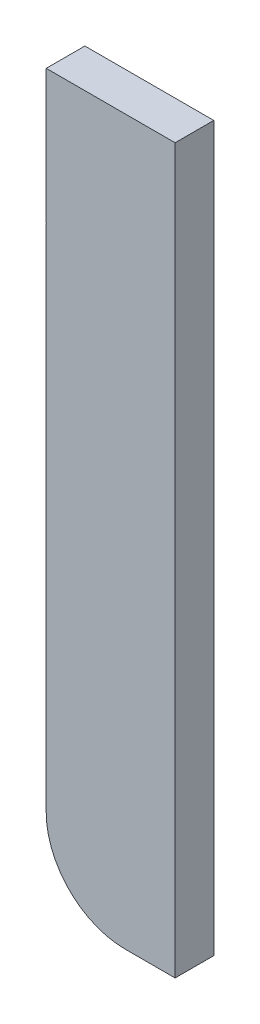
ISO-10303-21;
HEADER;
FILE_DESCRIPTION(('STEP AP214'),'2;1');
FILE_NAME('part.step','',(''),(''),'','','');
FILE_SCHEMA(('AUTOMOTIVE_DESIGN { 1 0 10303 214 1 1 1 1 }'));
ENDSEC;
DATA;
#1=APPLICATION_CONTEXT('core data for automotive mechanical design processes');
#2=APPLICATION_PROTOCOL_DEFINITION('international standard','automotive_design',2000,#1);
#3=PRODUCT_CONTEXT('',#1,'mechanical');
#4=PRODUCT('Part','Part','',(#3));
#5=PRODUCT_RELATED_PRODUCT_CATEGORY('part','',(#4));
#6=PRODUCT_DEFINITION_FORMATION('','',#4);
#7=PRODUCT_DEFINITION_CONTEXT('part definition',#1,'design');
#8=PRODUCT_DEFINITION('design','',#6,#7);
#9=PRODUCT_DEFINITION_SHAPE('','',#8);
#10=(LENGTH_UNIT() NAMED_UNIT(*) SI_UNIT(.MILLI.,.METRE.));
#11=(NAMED_UNIT(*) PLANE_ANGLE_UNIT() SI_UNIT($,.RADIAN.));
#12=(NAMED_UNIT(*) SI_UNIT($,.STERADIAN.) SOLID_ANGLE_UNIT());
#13=UNCERTAINTY_MEASURE_WITH_UNIT(LENGTH_MEASURE(1.E-05),#10,'distance_accuracy_value','');
#14=(GEOMETRIC_REPRESENTATION_CONTEXT(3) GLOBAL_UNCERTAINTY_ASSIGNED_CONTEXT((#13)) GLOBAL_UNIT_ASSIGNED_CONTEXT((#10,
#11,#12)) REPRESENTATION_CONTEXT('',''));
#15=CARTESIAN_POINT('',(0.,0.,0.));
#16=DIRECTION('',(0.,0.,1.));
#17=DIRECTION('',(1.,0.,0.));
#18=AXIS2_PLACEMENT_3D('',#15,#16,#17);
#19=CARTESIAN_POINT('',(27.4,24.1,1.47));
#20=DIRECTION('',(0.,0.,-1.));
#21=DIRECTION('',(-1.,0.,0.));
#22=AXIS2_PLACEMENT_3D('',#19,#20,#21);
#23=CYLINDRICAL_SURFACE('',#22,0.00249999999999903);
#24=CARTESIAN_POINT('',(27.4,24.1,0.));
#25=DIRECTION('',(0.,0.,1.));
#26=DIRECTION('',(1.,0.,0.));
#27=AXIS2_PLACEMENT_3D('',#24,#25,#26);
#28=CIRCLE('',#27,0.00249999999999903);
#29=CARTESIAN_POINT('',(27.4,24.0975,0.));
#30=VERTEX_POINT('',#29);
#31=CARTESIAN_POINT('',(27.4,24.1025,0.));
#32=VERTEX_POINT('',#31);
#33=EDGE_CURVE('E132',#30,#32,#28,.T.);
#34=ORIENTED_EDGE('',*,*,#33,.F.);
#35=DIRECTION('',(0.,0.,-1.));
#36=VECTOR('',#35,1.);
#37=CARTESIAN_POINT('',(27.4,24.0975,1.47));
#38=LINE('',#37,#36);
#39=CARTESIAN_POINT('',(27.4,24.0975,1.47));
#40=VERTEX_POINT('',#39);
#41=EDGE_CURVE('E11',#40,#30,#38,.T.);
#42=ORIENTED_EDGE('',*,*,#41,.F.);
#43=CARTESIAN_POINT('',(27.4,24.1,1.47));
#44=DIRECTION('',(0.,0.,1.));
#45=DIRECTION('',(1.,0.,0.));
#46=AXIS2_PLACEMENT_3D('',#43,#44,#45);
#47=CIRCLE('',#46,0.00249999999999903);
#48=CARTESIAN_POINT('',(27.4,24.1025,1.47));
#49=VERTEX_POINT('',#48);
#50=EDGE_CURVE('E188',#40,#49,#47,.T.);
#51=ORIENTED_EDGE('',*,*,#50,.T.);
#52=DIRECTION('',(0.,0.,-1.));
#53=VECTOR('',#52,1.);
#54=CARTESIAN_POINT('',(27.4,24.1025,1.47));
#55=LINE('',#54,#53);
#56=EDGE_CURVE('E85',#49,#32,#55,.T.);
#57=ORIENTED_EDGE('',*,*,#56,.T.);
#58=EDGE_LOOP('',(#34,#42,#51,#57));
#59=FACE_BOUND('',#58,.T.);
#60=ADVANCED_FACE('F32',(#59),#23,.F.);
#61=CARTESIAN_POINT('',(27.4,0.,1.47));
#62=DIRECTION('',(1.,0.,0.));
#63=DIRECTION('',(0.,0.,-1.));
#64=AXIS2_PLACEMENT_3D('',#61,#62,#63);
#65=PLANE('',#64);
#66=DIRECTION('',(0.,-1.,0.));
#67=VECTOR('',#66,1.);
#68=CARTESIAN_POINT('',(27.4,0.,0.));
#69=LINE('',#68,#67);
#70=CARTESIAN_POINT('',(27.4,4.7,0.));
#71=VERTEX_POINT('',#70);
#72=EDGE_CURVE('E135',#30,#71,#69,.T.);
#73=ORIENTED_EDGE('',*,*,#72,.T.);
#74=DIRECTION('',(0.,0.,-1.));
#75=VECTOR('',#74,1.);
#76=CARTESIAN_POINT('',(27.4,4.7,1.47));
#77=LINE('',#76,#75);
#78=CARTESIAN_POINT('',(27.4,4.7,1.47));
#79=VERTEX_POINT('',#78);
#80=EDGE_CURVE('E40',#79,#71,#77,.T.);
#81=ORIENTED_EDGE('',*,*,#80,.F.);
#82=DIRECTION('',(0.,-1.,0.));
#83=VECTOR('',#82,1.);
#84=CARTESIAN_POINT('',(27.4,0.,1.47));
#85=LINE('',#84,#83);
#86=EDGE_CURVE('E184',#40,#79,#85,.T.);
#87=ORIENTED_EDGE('',*,*,#86,.F.);
#88=ORIENTED_EDGE('',*,*,#41,.T.);
#89=EDGE_LOOP('',(#73,#81,#87,#88));
#90=FACE_BOUND('',#89,.T.);
#91=ADVANCED_FACE('F191',(#90),#65,.F.);
#92=CARTESIAN_POINT('',(30.4,4.7,1.47));
#93=DIRECTION('',(0.,0.,-1.));
#94=DIRECTION('',(-1.,0.,0.));
#95=AXIS2_PLACEMENT_3D('',#92,#93,#94);
#96=CYLINDRICAL_SURFACE('',#95,3.);
#97=CARTESIAN_POINT('',(30.4,4.7,0.));
#98=DIRECTION('',(0.,0.,1.));
#99=DIRECTION('',(1.,0.,0.));
#100=AXIS2_PLACEMENT_3D('',#97,#98,#99);
#101=CIRCLE('',#100,3.);
#102=CARTESIAN_POINT('',(30.4,1.7,0.));
#103=VERTEX_POINT('',#102);
#104=EDGE_CURVE('E137',#71,#103,#101,.T.);
#105=ORIENTED_EDGE('',*,*,#104,.T.);
#106=DIRECTION('',(0.,0.,-1.));
#107=VECTOR('',#106,1.);
#108=CARTESIAN_POINT('',(30.4,1.7,1.47));
#109=LINE('',#108,#107);
#110=CARTESIAN_POINT('',(30.4,1.7,1.47));
#111=VERTEX_POINT('',#110);
#112=EDGE_CURVE('E158',#111,#103,#109,.T.);
#113=ORIENTED_EDGE('',*,*,#112,.F.);
#114=CARTESIAN_POINT('',(30.4,4.7,1.47));
#115=DIRECTION('',(0.,0.,1.));
#116=DIRECTION('',(1.,0.,0.));
#117=AXIS2_PLACEMENT_3D('',#114,#115,#116);
#118=CIRCLE('',#117,3.);
#119=EDGE_CURVE('E167',#79,#111,#118,.T.);
#120=ORIENTED_EDGE('',*,*,#119,.F.);
#121=ORIENTED_EDGE('',*,*,#80,.T.);
#122=EDGE_LOOP('',(#105,#113,#120,#121));
#123=FACE_BOUND('',#122,.T.);
#124=ADVANCED_FACE('F165',(#123),#96,.T.);
#125=CARTESIAN_POINT('',(0.,1.7,1.47));
#126=DIRECTION('',(0.,1.,0.));
#127=DIRECTION('',(0.,0.,1.));
#128=AXIS2_PLACEMENT_3D('',#125,#126,#127);
#129=PLANE('',#128);
#130=DIRECTION('',(1.,0.,0.));
#131=VECTOR('',#130,1.);
#132=CARTESIAN_POINT('',(0.,1.7,0.));
#133=LINE('',#132,#131);
#134=CARTESIAN_POINT('',(32.3,1.7,0.));
#135=VERTEX_POINT('',#134);
#136=EDGE_CURVE('E139',#103,#135,#133,.T.);
#137=ORIENTED_EDGE('',*,*,#136,.T.);
#138=DIRECTION('',(0.,0.,-1.));
#139=VECTOR('',#138,1.);
#140=CARTESIAN_POINT('',(32.3,1.7,1.47));
#141=LINE('',#140,#139);
#142=CARTESIAN_POINT('',(32.3,1.7,1.47));
#143=VERTEX_POINT('',#142);
#144=EDGE_CURVE('E156',#143,#135,#141,.T.);
#145=ORIENTED_EDGE('',*,*,#144,.F.);
#146=DIRECTION('',(1.,0.,0.));
#147=VECTOR('',#146,1.);
#148=CARTESIAN_POINT('',(0.,1.7,1.47));
#149=LINE('',#148,#147);
#150=EDGE_CURVE('E180',#111,#143,#149,.T.);
#151=ORIENTED_EDGE('',*,*,#150,.F.);
#152=ORIENTED_EDGE('',*,*,#112,.T.);
#153=EDGE_LOOP('',(#137,#145,#151,#152));
#154=FACE_BOUND('',#153,.T.);
#155=ADVANCED_FACE('F177',(#154),#129,.F.);
#156=CARTESIAN_POINT('',(32.3,0.,1.47));
#157=DIRECTION('',(1.,0.,0.));
#158=DIRECTION('',(0.,0.,-1.));
#159=AXIS2_PLACEMENT_3D('',#156,#157,#158);
#160=PLANE('',#159);
#161=DIRECTION('',(0.,-1.,0.));
#162=VECTOR('',#161,1.);
#163=CARTESIAN_POINT('',(32.3,0.,0.));
#164=LINE('',#163,#162);
#165=CARTESIAN_POINT('',(32.3,29.2,0.));
#166=VERTEX_POINT('',#165);
#167=EDGE_CURVE('E142',#166,#135,#164,.T.);
#168=ORIENTED_EDGE('',*,*,#167,.F.);
#169=DIRECTION('',(0.,0.,-1.));
#170=VECTOR('',#169,1.);
#171=CARTESIAN_POINT('',(32.3,29.2,1.47));
#172=LINE('',#171,#170);
#173=CARTESIAN_POINT('',(32.3,29.2,1.47));
#174=VERTEX_POINT('',#173);
#175=EDGE_CURVE('E154',#174,#166,#172,.T.);
#176=ORIENTED_EDGE('',*,*,#175,.F.);
#177=DIRECTION('',(0.,-1.,0.));
#178=VECTOR('',#177,1.);
#179=CARTESIAN_POINT('',(32.3,0.,1.47));
#180=LINE('',#179,#178);
#181=EDGE_CURVE('E181',#174,#143,#180,.T.);
#182=ORIENTED_EDGE('',*,*,#181,.T.);
#183=ORIENTED_EDGE('',*,*,#144,.T.);
#184=EDGE_LOOP('',(#168,#176,#182,#183));
#185=FACE_BOUND('',#184,.T.);
#186=ADVANCED_FACE('F202',(#185),#160,.T.);
#187=CARTESIAN_POINT('',(0.,29.2,1.47));
#188=DIRECTION('',(0.,-1.,0.));
#189=DIRECTION('',(0.,0.,-1.));
#190=AXIS2_PLACEMENT_3D('',#187,#188,#189);
#191=PLANE('',#190);
#192=DIRECTION('',(-1.,0.,0.));
#193=VECTOR('',#192,1.);
#194=CARTESIAN_POINT('',(0.,29.2,0.));
#195=LINE('',#194,#193);
#196=CARTESIAN_POINT('',(27.4,29.2,0.));
#197=VERTEX_POINT('',#196);
#198=EDGE_CURVE('E145',#166,#197,#195,.T.);
#199=ORIENTED_EDGE('',*,*,#198,.T.);
#200=DIRECTION('',(0.,0.,-1.));
#201=VECTOR('',#200,1.);
#202=CARTESIAN_POINT('',(27.4,29.2,1.47));
#203=LINE('',#202,#201);
#204=CARTESIAN_POINT('',(27.4,29.2,1.47));
#205=VERTEX_POINT('',#204);
#206=EDGE_CURVE('E126',#205,#197,#203,.T.);
#207=ORIENTED_EDGE('',*,*,#206,.F.);
#208=DIRECTION('',(-1.,0.,0.));
#209=VECTOR('',#208,1.);
#210=CARTESIAN_POINT('',(0.,29.2,1.47));
#211=LINE('',#210,#209);
#212=EDGE_CURVE('E113',#174,#205,#211,.T.);
#213=ORIENTED_EDGE('',*,*,#212,.F.);
#214=ORIENTED_EDGE('',*,*,#175,.T.);
#215=EDGE_LOOP('',(#199,#207,#213,#214));
#216=FACE_BOUND('',#215,.T.);
#217=ADVANCED_FACE('F205',(#216),#191,.F.);
#218=CARTESIAN_POINT('',(27.4,0.,1.47));
#219=DIRECTION('',(1.,0.,0.));
#220=DIRECTION('',(0.,0.,-1.));
#221=AXIS2_PLACEMENT_3D('',#218,#219,#220);
#222=PLANE('',#221);
#223=DIRECTION('',(0.,-1.,0.));
#224=VECTOR('',#223,1.);
#225=CARTESIAN_POINT('',(27.4,0.,0.));
#226=LINE('',#225,#224);
#227=CARTESIAN_POINT('',(27.4,24.6025,0.));
#228=VERTEX_POINT('',#227);
#229=EDGE_CURVE('E122',#197,#228,#226,.T.);
#230=ORIENTED_EDGE('',*,*,#229,.T.);
#231=DIRECTION('',(0.,0.,-1.));
#232=VECTOR('',#231,1.);
#233=CARTESIAN_POINT('',(27.4,24.6025,1.47));
#234=LINE('',#233,#232);
#235=CARTESIAN_POINT('',(27.4,24.6025,1.47));
#236=VERTEX_POINT('',#235);
#237=EDGE_CURVE('E119',#236,#228,#234,.T.);
#238=ORIENTED_EDGE('',*,*,#237,.F.);
#239=DIRECTION('',(0.,-1.,0.));
#240=VECTOR('',#239,1.);
#241=CARTESIAN_POINT('',(27.4,0.,1.47));
#242=LINE('',#241,#240);
#243=EDGE_CURVE('E106',#205,#236,#242,.T.);
#244=ORIENTED_EDGE('',*,*,#243,.F.);
#245=ORIENTED_EDGE('',*,*,#206,.T.);
#246=EDGE_LOOP('',(#230,#238,#244,#245));
#247=FACE_BOUND('',#246,.T.);
#248=ADVANCED_FACE('F120',(#247),#222,.F.);
#249=CARTESIAN_POINT('',(27.4,24.6,1.47));
#250=DIRECTION('',(0.,0.,-1.));
#251=DIRECTION('',(-1.,0.,0.));
#252=AXIS2_PLACEMENT_3D('',#249,#250,#251);
#253=CYLINDRICAL_SURFACE('',#252,0.00249999999999903);
#254=CARTESIAN_POINT('',(27.4,24.6,0.));
#255=DIRECTION('',(0.,0.,1.));
#256=DIRECTION('',(1.,0.,0.));
#257=AXIS2_PLACEMENT_3D('',#254,#255,#256);
#258=CIRCLE('',#257,0.00249999999999903);
#259=CARTESIAN_POINT('',(27.4,24.5975,0.));
#260=VERTEX_POINT('',#259);
#261=EDGE_CURVE('E148',#260,#228,#258,.T.);
#262=ORIENTED_EDGE('',*,*,#261,.F.);
#263=DIRECTION('',(0.,0.,-1.));
#264=VECTOR('',#263,1.);
#265=CARTESIAN_POINT('',(27.4,24.5975,1.47));
#266=LINE('',#265,#264);
#267=CARTESIAN_POINT('',(27.4,24.5975,1.47));
#268=VERTEX_POINT('',#267);
#269=EDGE_CURVE('E78',#268,#260,#266,.T.);
#270=ORIENTED_EDGE('',*,*,#269,.F.);
#271=CARTESIAN_POINT('',(27.4,24.6,1.47));
#272=DIRECTION('',(0.,0.,1.));
#273=DIRECTION('',(1.,0.,0.));
#274=AXIS2_PLACEMENT_3D('',#271,#272,#273);
#275=CIRCLE('',#274,0.00249999999999903);
#276=EDGE_CURVE('E110',#268,#236,#275,.T.);
#277=ORIENTED_EDGE('',*,*,#276,.T.);
#278=ORIENTED_EDGE('',*,*,#237,.T.);
#279=EDGE_LOOP('',(#262,#270,#277,#278));
#280=FACE_BOUND('',#279,.T.);
#281=ADVANCED_FACE('F128',(#280),#253,.F.);
#282=EDGE_CURVE('E149',#260,#32,#226,.T.);
#283=ORIENTED_EDGE('',*,*,#282,.T.);
#284=ORIENTED_EDGE('',*,*,#56,.F.);
#285=EDGE_CURVE('E48',#268,#49,#242,.T.);
#286=ORIENTED_EDGE('',*,*,#285,.F.);
#287=ORIENTED_EDGE('',*,*,#269,.T.);
#288=EDGE_LOOP('',(#283,#284,#286,#287));
#289=FACE_BOUND('',#288,.T.);
#290=ADVANCED_FACE('F189',(#289),#222,.F.);
#291=CARTESIAN_POINT('',(0.,0.,1.47));
#292=DIRECTION('',(0.,0.,1.));
#293=DIRECTION('',(1.,0.,0.));
#294=AXIS2_PLACEMENT_3D('',#291,#292,#293);
#295=PLANE('',#294);
#296=ORIENTED_EDGE('',*,*,#50,.F.);
#297=ORIENTED_EDGE('',*,*,#86,.T.);
#298=ORIENTED_EDGE('',*,*,#119,.T.);
#299=ORIENTED_EDGE('',*,*,#150,.T.);
#300=ORIENTED_EDGE('',*,*,#181,.F.);
#301=ORIENTED_EDGE('',*,*,#212,.T.);
#302=ORIENTED_EDGE('',*,*,#243,.T.);
#303=ORIENTED_EDGE('',*,*,#276,.F.);
#304=ORIENTED_EDGE('',*,*,#285,.T.);
#305=EDGE_LOOP('',(#296,#297,#298,#299,#300,#301,#302,#303,#304));
#306=FACE_BOUND('',#305,.T.);
#307=ADVANCED_FACE('F108',(#306),#295,.T.);
#308=CARTESIAN_POINT('',(0.,0.,0.));
#309=DIRECTION('',(0.,0.,1.));
#310=DIRECTION('',(1.,0.,0.));
#311=AXIS2_PLACEMENT_3D('',#308,#309,#310);
#312=PLANE('',#311);
#313=ORIENTED_EDGE('',*,*,#33,.T.);
#314=ORIENTED_EDGE('',*,*,#282,.F.);
#315=ORIENTED_EDGE('',*,*,#261,.T.);
#316=ORIENTED_EDGE('',*,*,#229,.F.);
#317=ORIENTED_EDGE('',*,*,#198,.F.);
#318=ORIENTED_EDGE('',*,*,#167,.T.);
#319=ORIENTED_EDGE('',*,*,#136,.F.);
#320=ORIENTED_EDGE('',*,*,#104,.F.);
#321=ORIENTED_EDGE('',*,*,#72,.F.);
#322=EDGE_LOOP('',(#313,#314,#315,#316,#317,#318,#319,#320,#321));
#323=FACE_BOUND('',#322,.T.);
#324=ADVANCED_FACE('F172',(#323),#312,.F.);
#325=CLOSED_SHELL('',(#60,#91,#124,#155,#186,#217,#248,#281,#290,#307,#324));
#326=MANIFOLD_SOLID_BREP('B2',#325);
#327=ADVANCED_BREP_SHAPE_REPRESENTATION('',(#18,#326),#14);
#328=SHAPE_DEFINITION_REPRESENTATION(#9,#327);
ENDSEC;
END-ISO-10303-21;
